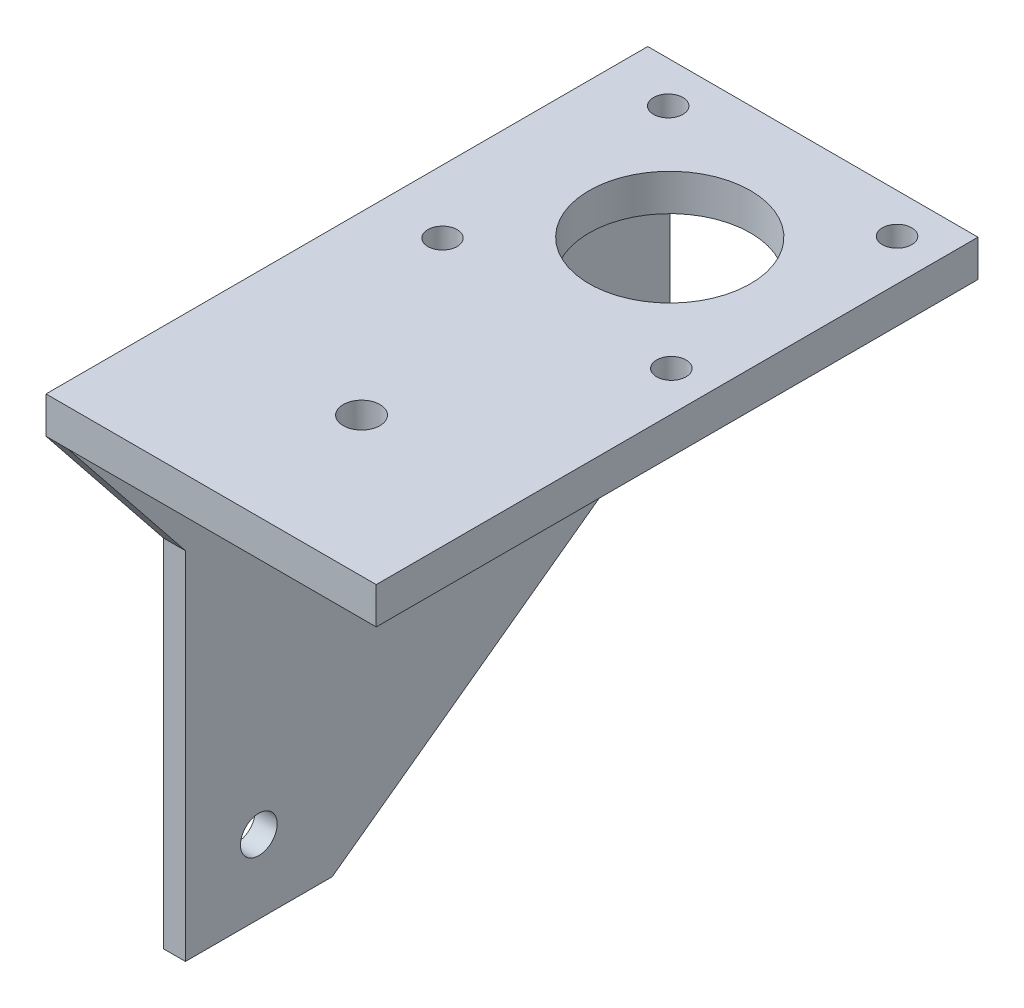
ISO-10303-21;
HEADER;
FILE_DESCRIPTION(('STEP AP214'),'2;1');
FILE_NAME('part.step','',(''),(''),'','','');
FILE_SCHEMA(('AUTOMOTIVE_DESIGN { 1 0 10303 214 1 1 1 1 }'));
ENDSEC;
DATA;
#1=APPLICATION_CONTEXT('core data for automotive mechanical design processes');
#2=APPLICATION_PROTOCOL_DEFINITION('international standard','automotive_design',2000,#1);
#3=PRODUCT_CONTEXT('',#1,'mechanical');
#4=PRODUCT('Part','Part','',(#3));
#5=PRODUCT_RELATED_PRODUCT_CATEGORY('part','',(#4));
#6=PRODUCT_DEFINITION_FORMATION('','',#4);
#7=PRODUCT_DEFINITION_CONTEXT('part definition',#1,'design');
#8=PRODUCT_DEFINITION('design','',#6,#7);
#9=PRODUCT_DEFINITION_SHAPE('','',#8);
#10=(LENGTH_UNIT() NAMED_UNIT(*) SI_UNIT(.MILLI.,.METRE.));
#11=(NAMED_UNIT(*) PLANE_ANGLE_UNIT() SI_UNIT($,.RADIAN.));
#12=(NAMED_UNIT(*) SI_UNIT($,.STERADIAN.) SOLID_ANGLE_UNIT());
#13=UNCERTAINTY_MEASURE_WITH_UNIT(LENGTH_MEASURE(1.E-05),#10,'distance_accuracy_value','');
#14=(GEOMETRIC_REPRESENTATION_CONTEXT(3) GLOBAL_UNCERTAINTY_ASSIGNED_CONTEXT((#13)) GLOBAL_UNIT_ASSIGNED_CONTEXT((#10,
#11,#12)) REPRESENTATION_CONTEXT('',''));
#15=CARTESIAN_POINT('',(0.,0.,0.));
#16=DIRECTION('',(0.,0.,1.));
#17=DIRECTION('',(1.,0.,0.));
#18=AXIS2_PLACEMENT_3D('',#15,#16,#17);
#19=CARTESIAN_POINT('',(0.,5.,-42.));
#20=DIRECTION('',(0.,-1.,0.));
#21=DIRECTION('',(0.,0.,1.));
#22=AXIS2_PLACEMENT_3D('',#19,#20,#21);
#23=PLANE('',#22);
#24=CARTESIAN_POINT('',(0.,5.,0.));
#25=DIRECTION('',(0.,1.,0.));
#26=DIRECTION('',(0.,0.,1.));
#27=AXIS2_PLACEMENT_3D('',#24,#25,#26);
#28=CIRCLE('',#27,2.5);
#29=CARTESIAN_POINT('',(0.,5.,2.5));
#30=VERTEX_POINT('',#29);
#31=EDGE_CURVE('E223',#30,#30,#28,.T.);
#32=ORIENTED_EDGE('',*,*,#31,.F.);
#33=EDGE_LOOP('',(#32));
#34=FACE_BOUND('',#33,.T.);
#35=DIRECTION('',(0.,0.,1.));
#36=VECTOR('',#35,1.);
#37=CARTESIAN_POINT('',(21.,5.,-63.));
#38=LINE('',#37,#36);
#39=CARTESIAN_POINT('',(21.,5.,-63.));
#40=VERTEX_POINT('',#39);
#41=CARTESIAN_POINT('',(21.,5.,19.));
#42=VERTEX_POINT('',#41);
#43=EDGE_CURVE('E67',#40,#42,#38,.T.);
#44=ORIENTED_EDGE('',*,*,#43,.F.);
#45=DIRECTION('',(1.,0.,0.));
#46=VECTOR('',#45,1.);
#47=CARTESIAN_POINT('',(-21.,5.,-63.));
#48=LINE('',#47,#46);
#49=CARTESIAN_POINT('',(-24.,5.,-63.));
#50=VERTEX_POINT('',#49);
#51=EDGE_CURVE('E45',#50,#40,#48,.T.);
#52=ORIENTED_EDGE('',*,*,#51,.F.);
#53=DIRECTION('',(0.,0.,-1.));
#54=VECTOR('',#53,1.);
#55=CARTESIAN_POINT('',(-24.,5.,19.));
#56=LINE('',#55,#54);
#57=CARTESIAN_POINT('',(-24.,5.,19.));
#58=VERTEX_POINT('',#57);
#59=EDGE_CURVE('E115',#58,#50,#56,.T.);
#60=ORIENTED_EDGE('',*,*,#59,.F.);
#61=DIRECTION('',(-1.,0.,0.));
#62=VECTOR('',#61,1.);
#63=CARTESIAN_POINT('',(-21.,5.,19.));
#64=LINE('',#63,#62);
#65=EDGE_CURVE('E173',#42,#58,#64,.T.);
#66=ORIENTED_EDGE('',*,*,#65,.F.);
#67=EDGE_LOOP('',(#44,#52,#60,#66));
#68=FACE_BOUND('',#67,.T.);
#69=CARTESIAN_POINT('',(0.,5.,-42.));
#70=DIRECTION('',(0.,-1.,0.));
#71=DIRECTION('',(0.,0.,-1.));
#72=AXIS2_PLACEMENT_3D('',#69,#70,#71);
#73=CIRCLE('',#72,11.);
#74=CARTESIAN_POINT('',(0.,5.,-53.));
#75=VERTEX_POINT('',#74);
#76=EDGE_CURVE('E200',#75,#75,#73,.T.);
#77=ORIENTED_EDGE('',*,*,#76,.T.);
#78=EDGE_LOOP('',(#77));
#79=FACE_BOUND('',#78,.T.);
#80=CARTESIAN_POINT('',(-15.592519129157,5.,-57.3780150606921));
#81=DIRECTION('',(0.,-1.,0.));
#82=DIRECTION('',(0.,0.,-1.));
#83=AXIS2_PLACEMENT_3D('',#80,#81,#82);
#84=CIRCLE('',#83,2.);
#85=CARTESIAN_POINT('',(-15.592519129157,5.,-59.3780150606921));
#86=VERTEX_POINT('',#85);
#87=EDGE_CURVE('E194',#86,#86,#84,.T.);
#88=ORIENTED_EDGE('',*,*,#87,.T.);
#89=EDGE_LOOP('',(#88));
#90=FACE_BOUND('',#89,.T.);
#91=CARTESIAN_POINT('',(-15.3780150606921,5.,-26.407480870843));
#92=DIRECTION('',(0.,-1.,0.));
#93=DIRECTION('',(0.,0.,-1.));
#94=AXIS2_PLACEMENT_3D('',#91,#92,#93);
#95=CIRCLE('',#94,2.);
#96=CARTESIAN_POINT('',(-15.3780150606921,5.,-28.407480870843));
#97=VERTEX_POINT('',#96);
#98=EDGE_CURVE('E188',#97,#97,#95,.T.);
#99=ORIENTED_EDGE('',*,*,#98,.T.);
#100=EDGE_LOOP('',(#99));
#101=FACE_BOUND('',#100,.T.);
#102=CARTESIAN_POINT('',(15.592519129157,5.,-26.6219849393079));
#103=DIRECTION('',(0.,-1.,0.));
#104=DIRECTION('',(0.,0.,-1.));
#105=AXIS2_PLACEMENT_3D('',#102,#103,#104);
#106=CIRCLE('',#105,2.);
#107=CARTESIAN_POINT('',(15.592519129157,5.,-28.6219849393079));
#108=VERTEX_POINT('',#107);
#109=EDGE_CURVE('E182',#108,#108,#106,.T.);
#110=ORIENTED_EDGE('',*,*,#109,.T.);
#111=EDGE_LOOP('',(#110));
#112=FACE_BOUND('',#111,.T.);
#113=CARTESIAN_POINT('',(15.3780150606921,5.,-57.592519129157));
#114=DIRECTION('',(0.,-1.,0.));
#115=DIRECTION('',(0.,0.,-1.));
#116=AXIS2_PLACEMENT_3D('',#113,#114,#115);
#117=CIRCLE('',#116,2.);
#118=CARTESIAN_POINT('',(15.3780150606921,5.,-59.592519129157));
#119=VERTEX_POINT('',#118);
#120=EDGE_CURVE('E176',#119,#119,#117,.T.);
#121=ORIENTED_EDGE('',*,*,#120,.T.);
#122=EDGE_LOOP('',(#121));
#123=FACE_BOUND('',#122,.T.);
#124=ADVANCED_FACE('F35',(#34,#68,#79,#90,#101,#112,#123),#23,.F.);
#125=CARTESIAN_POINT('',(0.,0.,-42.));
#126=DIRECTION('',(0.,-1.,0.));
#127=DIRECTION('',(0.,0.,1.));
#128=AXIS2_PLACEMENT_3D('',#125,#126,#127);
#129=PLANE('',#128);
#130=CARTESIAN_POINT('',(0.,0.,0.));
#131=DIRECTION('',(0.,-1.,0.));
#132=DIRECTION('',(0.,0.,-1.));
#133=AXIS2_PLACEMENT_3D('',#130,#131,#132);
#134=CIRCLE('',#133,2.5);
#135=CARTESIAN_POINT('',(0.,0.,-2.5));
#136=VERTEX_POINT('',#135);
#137=EDGE_CURVE('E39',#136,#136,#134,.T.);
#138=ORIENTED_EDGE('',*,*,#137,.F.);
#139=EDGE_LOOP('',(#138));
#140=FACE_BOUND('',#139,.T.);
#141=CARTESIAN_POINT('',(15.592519129157,0.,-26.6219849393079));
#142=DIRECTION('',(0.,-1.,0.));
#143=DIRECTION('',(0.,0.,-1.));
#144=AXIS2_PLACEMENT_3D('',#141,#142,#143);
#145=CIRCLE('',#144,2.);
#146=CARTESIAN_POINT('',(15.592519129157,0.,-28.6219849393079));
#147=VERTEX_POINT('',#146);
#148=EDGE_CURVE('E179',#147,#147,#145,.T.);
#149=ORIENTED_EDGE('',*,*,#148,.F.);
#150=EDGE_LOOP('',(#149));
#151=FACE_BOUND('',#150,.T.);
#152=CARTESIAN_POINT('',(-15.592519129157,0.,-57.3780150606921));
#153=DIRECTION('',(0.,-1.,0.));
#154=DIRECTION('',(0.,0.,-1.));
#155=AXIS2_PLACEMENT_3D('',#152,#153,#154);
#156=CIRCLE('',#155,2.);
#157=CARTESIAN_POINT('',(-15.592519129157,0.,-59.3780150606921));
#158=VERTEX_POINT('',#157);
#159=EDGE_CURVE('E191',#158,#158,#156,.T.);
#160=ORIENTED_EDGE('',*,*,#159,.F.);
#161=EDGE_LOOP('',(#160));
#162=FACE_BOUND('',#161,.T.);
#163=DIRECTION('',(0.,0.,1.));
#164=VECTOR('',#163,1.);
#165=CARTESIAN_POINT('',(21.,0.,-63.));
#166=LINE('',#165,#164);
#167=CARTESIAN_POINT('',(21.,0.,-63.));
#168=VERTEX_POINT('',#167);
#169=CARTESIAN_POINT('',(21.,0.,19.));
#170=VERTEX_POINT('',#169);
#171=EDGE_CURVE('E74',#168,#170,#166,.T.);
#172=ORIENTED_EDGE('',*,*,#171,.T.);
#173=DIRECTION('',(1.,0.,0.));
#174=VECTOR('',#173,1.);
#175=CARTESIAN_POINT('',(-21.,0.,19.));
#176=LINE('',#175,#174);
#177=CARTESIAN_POINT('',(-21.,0.,19.));
#178=VERTEX_POINT('',#177);
#179=EDGE_CURVE('E169',#178,#170,#176,.T.);
#180=ORIENTED_EDGE('',*,*,#179,.F.);
#181=DIRECTION('',(0.,0.,-1.));
#182=VECTOR('',#181,1.);
#183=CARTESIAN_POINT('',(-21.,0.,-63.));
#184=LINE('',#183,#182);
#185=CARTESIAN_POINT('',(-21.,0.,-63.));
#186=VERTEX_POINT('',#185);
#187=EDGE_CURVE('E208',#178,#186,#184,.T.);
#188=ORIENTED_EDGE('',*,*,#187,.T.);
#189=DIRECTION('',(1.,0.,0.));
#190=VECTOR('',#189,1.);
#191=CARTESIAN_POINT('',(-21.,0.,-63.));
#192=LINE('',#191,#190);
#193=EDGE_CURVE('E205',#186,#168,#192,.T.);
#194=ORIENTED_EDGE('',*,*,#193,.T.);
#195=EDGE_LOOP('',(#172,#180,#188,#194));
#196=FACE_BOUND('',#195,.T.);
#197=CARTESIAN_POINT('',(0.,0.,-42.));
#198=DIRECTION('',(0.,-1.,0.));
#199=DIRECTION('',(0.,0.,-1.));
#200=AXIS2_PLACEMENT_3D('',#197,#198,#199);
#201=CIRCLE('',#200,11.);
#202=CARTESIAN_POINT('',(0.,0.,-53.));
#203=VERTEX_POINT('',#202);
#204=EDGE_CURVE('E197',#203,#203,#201,.T.);
#205=ORIENTED_EDGE('',*,*,#204,.F.);
#206=EDGE_LOOP('',(#205));
#207=FACE_BOUND('',#206,.T.);
#208=CARTESIAN_POINT('',(-15.3780150606921,0.,-26.407480870843));
#209=DIRECTION('',(0.,-1.,0.));
#210=DIRECTION('',(0.,0.,-1.));
#211=AXIS2_PLACEMENT_3D('',#208,#209,#210);
#212=CIRCLE('',#211,2.);
#213=CARTESIAN_POINT('',(-15.3780150606921,0.,-28.407480870843));
#214=VERTEX_POINT('',#213);
#215=EDGE_CURVE('E185',#214,#214,#212,.T.);
#216=ORIENTED_EDGE('',*,*,#215,.F.);
#217=EDGE_LOOP('',(#216));
#218=FACE_BOUND('',#217,.T.);
#219=CARTESIAN_POINT('',(15.3780150606921,0.,-57.592519129157));
#220=DIRECTION('',(0.,-1.,0.));
#221=DIRECTION('',(0.,0.,-1.));
#222=AXIS2_PLACEMENT_3D('',#219,#220,#221);
#223=CIRCLE('',#222,2.);
#224=CARTESIAN_POINT('',(15.3780150606921,0.,-59.592519129157));
#225=VERTEX_POINT('',#224);
#226=EDGE_CURVE('E175',#225,#225,#223,.T.);
#227=ORIENTED_EDGE('',*,*,#226,.F.);
#228=EDGE_LOOP('',(#227));
#229=FACE_BOUND('',#228,.T.);
#230=ADVANCED_FACE('F231',(#140,#151,#162,#196,#207,#218,#229),#129,.T.);
#231=CARTESIAN_POINT('',(21.,5.,-63.));
#232=DIRECTION('',(-1.,0.,0.));
#233=DIRECTION('',(0.,0.,-1.));
#234=AXIS2_PLACEMENT_3D('',#231,#232,#233);
#235=PLANE('',#234);
#236=ORIENTED_EDGE('',*,*,#171,.F.);
#237=DIRECTION('',(0.,-1.,0.));
#238=VECTOR('',#237,1.);
#239=CARTESIAN_POINT('',(21.,5.,-63.));
#240=LINE('',#239,#238);
#241=EDGE_CURVE('E11',#40,#168,#240,.T.);
#242=ORIENTED_EDGE('',*,*,#241,.F.);
#243=ORIENTED_EDGE('',*,*,#43,.T.);
#244=DIRECTION('',(0.,1.,0.));
#245=VECTOR('',#244,1.);
#246=CARTESIAN_POINT('',(21.,5.,19.));
#247=LINE('',#246,#245);
#248=EDGE_CURVE('E171',#170,#42,#247,.T.);
#249=ORIENTED_EDGE('',*,*,#248,.F.);
#250=EDGE_LOOP('',(#236,#242,#243,#249));
#251=FACE_BOUND('',#250,.T.);
#252=ADVANCED_FACE('F37',(#251),#235,.F.);
#253=CARTESIAN_POINT('',(-21.,5.,-63.));
#254=DIRECTION('',(0.,0.,1.));
#255=DIRECTION('',(-1.,0.,0.));
#256=AXIS2_PLACEMENT_3D('',#253,#254,#255);
#257=PLANE('',#256);
#258=ORIENTED_EDGE('',*,*,#193,.F.);
#259=DIRECTION('',(0.,-1.,0.));
#260=VECTOR('',#259,1.);
#261=CARTESIAN_POINT('',(-21.,5.,-63.));
#262=LINE('',#261,#260);
#263=CARTESIAN_POINT('',(-21.,-35.,-63.));
#264=VERTEX_POINT('',#263);
#265=EDGE_CURVE('E62',#186,#264,#262,.T.);
#266=ORIENTED_EDGE('',*,*,#265,.T.);
#267=DIRECTION('',(1.,0.,0.));
#268=VECTOR('',#267,1.);
#269=CARTESIAN_POINT('',(-24.,-35.,-63.));
#270=LINE('',#269,#268);
#271=CARTESIAN_POINT('',(-24.,-35.,-63.));
#272=VERTEX_POINT('',#271);
#273=EDGE_CURVE('E122',#272,#264,#270,.T.);
#274=ORIENTED_EDGE('',*,*,#273,.F.);
#275=DIRECTION('',(0.,-1.,0.));
#276=VECTOR('',#275,1.);
#277=CARTESIAN_POINT('',(-24.,5.,-63.));
#278=LINE('',#277,#276);
#279=EDGE_CURVE('E119',#50,#272,#278,.T.);
#280=ORIENTED_EDGE('',*,*,#279,.F.);
#281=ORIENTED_EDGE('',*,*,#51,.T.);
#282=ORIENTED_EDGE('',*,*,#241,.T.);
#283=EDGE_LOOP('',(#258,#266,#274,#280,#281,#282));
#284=FACE_BOUND('',#283,.T.);
#285=ADVANCED_FACE('F120',(#284),#257,.F.);
#286=CARTESIAN_POINT('',(0.,5.,-42.));
#287=DIRECTION('',(0.,-1.,0.));
#288=DIRECTION('',(0.,0.,1.));
#289=AXIS2_PLACEMENT_3D('',#286,#287,#288);
#290=CYLINDRICAL_SURFACE('',#289,11.);
#291=ORIENTED_EDGE('',*,*,#76,.F.);
#292=EDGE_LOOP('',(#291));
#293=FACE_BOUND('',#292,.T.);
#294=ORIENTED_EDGE('',*,*,#204,.T.);
#295=EDGE_LOOP('',(#294));
#296=FACE_BOUND('',#295,.T.);
#297=ADVANCED_FACE('F240',(#293,#296),#290,.F.);
#298=CARTESIAN_POINT('',(-15.592519129157,5.,-57.3780150606921));
#299=DIRECTION('',(0.,-1.,0.));
#300=DIRECTION('',(0.,0.,1.));
#301=AXIS2_PLACEMENT_3D('',#298,#299,#300);
#302=CYLINDRICAL_SURFACE('',#301,2.);
#303=ORIENTED_EDGE('',*,*,#87,.F.);
#304=EDGE_LOOP('',(#303));
#305=FACE_BOUND('',#304,.T.);
#306=ORIENTED_EDGE('',*,*,#159,.T.);
#307=EDGE_LOOP('',(#306));
#308=FACE_BOUND('',#307,.T.);
#309=ADVANCED_FACE('F247',(#305,#308),#302,.F.);
#310=CARTESIAN_POINT('',(-15.3780150606921,5.,-26.407480870843));
#311=DIRECTION('',(0.,-1.,0.));
#312=DIRECTION('',(0.,0.,1.));
#313=AXIS2_PLACEMENT_3D('',#310,#311,#312);
#314=CYLINDRICAL_SURFACE('',#313,2.);
#315=ORIENTED_EDGE('',*,*,#98,.F.);
#316=EDGE_LOOP('',(#315));
#317=FACE_BOUND('',#316,.T.);
#318=ORIENTED_EDGE('',*,*,#215,.T.);
#319=EDGE_LOOP('',(#318));
#320=FACE_BOUND('',#319,.T.);
#321=ADVANCED_FACE('F290',(#317,#320),#314,.F.);
#322=CARTESIAN_POINT('',(15.592519129157,5.,-26.6219849393079));
#323=DIRECTION('',(0.,-1.,0.));
#324=DIRECTION('',(0.,0.,1.));
#325=AXIS2_PLACEMENT_3D('',#322,#323,#324);
#326=CYLINDRICAL_SURFACE('',#325,2.);
#327=ORIENTED_EDGE('',*,*,#109,.F.);
#328=EDGE_LOOP('',(#327));
#329=FACE_BOUND('',#328,.T.);
#330=ORIENTED_EDGE('',*,*,#148,.T.);
#331=EDGE_LOOP('',(#330));
#332=FACE_BOUND('',#331,.T.);
#333=ADVANCED_FACE('F286',(#329,#332),#326,.F.);
#334=CARTESIAN_POINT('',(15.3780150606921,5.,-57.592519129157));
#335=DIRECTION('',(0.,-1.,0.));
#336=DIRECTION('',(0.,0.,1.));
#337=AXIS2_PLACEMENT_3D('',#334,#335,#336);
#338=CYLINDRICAL_SURFACE('',#337,2.);
#339=ORIENTED_EDGE('',*,*,#120,.F.);
#340=EDGE_LOOP('',(#339));
#341=FACE_BOUND('',#340,.T.);
#342=ORIENTED_EDGE('',*,*,#226,.T.);
#343=EDGE_LOOP('',(#342));
#344=FACE_BOUND('',#343,.T.);
#345=ADVANCED_FACE('F280',(#341,#344),#338,.F.);
#346=CARTESIAN_POINT('',(0.,0.,19.));
#347=DIRECTION('',(0.,0.,1.));
#348=DIRECTION('',(1.,0.,0.));
#349=AXIS2_PLACEMENT_3D('',#346,#347,#348);
#350=PLANE('',#349);
#351=ORIENTED_EDGE('',*,*,#65,.T.);
#352=DIRECTION('',(0.,1.,0.));
#353=VECTOR('',#352,1.);
#354=CARTESIAN_POINT('',(-24.,0.,19.));
#355=LINE('',#354,#353);
#356=CARTESIAN_POINT('',(-24.,0.,19.));
#357=VERTEX_POINT('',#356);
#358=EDGE_CURVE('E130',#357,#58,#355,.T.);
#359=ORIENTED_EDGE('',*,*,#358,.F.);
#360=DIRECTION('',(1.,0.,0.));
#361=VECTOR('',#360,1.);
#362=CARTESIAN_POINT('',(-24.,0.,19.));
#363=LINE('',#362,#361);
#364=EDGE_CURVE('E148',#357,#178,#363,.T.);
#365=ORIENTED_EDGE('',*,*,#364,.T.);
#366=ORIENTED_EDGE('',*,*,#179,.T.);
#367=ORIENTED_EDGE('',*,*,#248,.T.);
#368=EDGE_LOOP('',(#351,#359,#365,#366,#367));
#369=FACE_BOUND('',#368,.T.);
#370=ADVANCED_FACE('F254',(#369),#350,.T.);
#371=CARTESIAN_POINT('',(-24.,-35.,-63.));
#372=DIRECTION('',(0.,0.808520963920778,0.588467374542222));
#373=DIRECTION('',(0.,-0.588467374542222,0.808520963920778));
#374=AXIS2_PLACEMENT_3D('',#371,#372,#373);
#375=PLANE('',#374);
#376=DIRECTION('',(0.,-0.588467374542222,0.808520963920778));
#377=VECTOR('',#376,1.);
#378=CARTESIAN_POINT('',(-21.,-35.,-63.));
#379=LINE('',#378,#377);
#380=CARTESIAN_POINT('',(-21.,-68.4802688327011,-16.9999999999999));
#381=VERTEX_POINT('',#380);
#382=EDGE_CURVE('E150',#264,#381,#379,.T.);
#383=ORIENTED_EDGE('',*,*,#382,.T.);
#384=DIRECTION('',(1.,0.,0.));
#385=VECTOR('',#384,1.);
#386=CARTESIAN_POINT('',(-24.,-68.4802688327011,-16.9999999999999));
#387=LINE('',#386,#385);
#388=CARTESIAN_POINT('',(-24.,-68.4802688327011,-16.9999999999999));
#389=VERTEX_POINT('',#388);
#390=EDGE_CURVE('E165',#389,#381,#387,.T.);
#391=ORIENTED_EDGE('',*,*,#390,.F.);
#392=DIRECTION('',(0.,-0.588467374542222,0.808520963920778));
#393=VECTOR('',#392,1.);
#394=CARTESIAN_POINT('',(-24.,-35.,-63.));
#395=LINE('',#394,#393);
#396=EDGE_CURVE('E125',#272,#389,#395,.T.);
#397=ORIENTED_EDGE('',*,*,#396,.F.);
#398=ORIENTED_EDGE('',*,*,#273,.T.);
#399=EDGE_LOOP('',(#383,#391,#397,#398));
#400=FACE_BOUND('',#399,.T.);
#401=ADVANCED_FACE('F273',(#400),#375,.F.);
#402=CARTESIAN_POINT('',(-24.,-68.4802688327011,-16.9999999999999));
#403=DIRECTION('',(0.,1.,0.));
#404=DIRECTION('',(0.,0.,1.));
#405=AXIS2_PLACEMENT_3D('',#402,#403,#404);
#406=PLANE('',#405);
#407=DIRECTION('',(0.,0.,1.));
#408=VECTOR('',#407,1.);
#409=CARTESIAN_POINT('',(-21.,-68.4802688327011,-16.9999999999999));
#410=LINE('',#409,#408);
#411=CARTESIAN_POINT('',(-21.,-68.4802688327011,3.00000000000007));
#412=VERTEX_POINT('',#411);
#413=EDGE_CURVE('E153',#381,#412,#410,.T.);
#414=ORIENTED_EDGE('',*,*,#413,.T.);
#415=DIRECTION('',(1.,0.,0.));
#416=VECTOR('',#415,1.);
#417=CARTESIAN_POINT('',(-24.,-68.4802688327011,3.00000000000007));
#418=LINE('',#417,#416);
#419=CARTESIAN_POINT('',(-24.,-68.4802688327011,3.00000000000007));
#420=VERTEX_POINT('',#419);
#421=EDGE_CURVE('E162',#420,#412,#418,.T.);
#422=ORIENTED_EDGE('',*,*,#421,.F.);
#423=DIRECTION('',(0.,0.,1.));
#424=VECTOR('',#423,1.);
#425=CARTESIAN_POINT('',(-24.,-68.4802688327011,-16.9999999999999));
#426=LINE('',#425,#424);
#427=EDGE_CURVE('E141',#389,#420,#426,.T.);
#428=ORIENTED_EDGE('',*,*,#427,.F.);
#429=ORIENTED_EDGE('',*,*,#390,.T.);
#430=EDGE_LOOP('',(#414,#422,#428,#429));
#431=FACE_BOUND('',#430,.T.);
#432=ADVANCED_FACE('F269',(#431),#406,.F.);
#433=CARTESIAN_POINT('',(-24.,-42.1563099903324,3.00000000000007));
#434=DIRECTION('',(0.,0.,-1.));
#435=DIRECTION('',(-1.,0.,0.));
#436=AXIS2_PLACEMENT_3D('',#433,#434,#435);
#437=PLANE('',#436);
#438=DIRECTION('',(0.,1.,0.));
#439=VECTOR('',#438,1.);
#440=CARTESIAN_POINT('',(-21.,-42.1563099903324,3.00000000000007));
#441=LINE('',#440,#439);
#442=CARTESIAN_POINT('',(-21.,-20.,3.00000000000007));
#443=VERTEX_POINT('',#442);
#444=EDGE_CURVE('E134',#412,#443,#441,.T.);
#445=ORIENTED_EDGE('',*,*,#444,.T.);
#446=DIRECTION('',(1.,0.,0.));
#447=VECTOR('',#446,1.);
#448=CARTESIAN_POINT('',(-24.,-20.,3.00000000000007));
#449=LINE('',#448,#447);
#450=CARTESIAN_POINT('',(-24.,-20.,3.00000000000007));
#451=VERTEX_POINT('',#450);
#452=EDGE_CURVE('E159',#451,#443,#449,.T.);
#453=ORIENTED_EDGE('',*,*,#452,.F.);
#454=DIRECTION('',(0.,1.,0.));
#455=VECTOR('',#454,1.);
#456=CARTESIAN_POINT('',(-24.,-68.4802688327011,3.00000000000007));
#457=LINE('',#456,#455);
#458=EDGE_CURVE('E143',#420,#451,#457,.T.);
#459=ORIENTED_EDGE('',*,*,#458,.F.);
#460=ORIENTED_EDGE('',*,*,#421,.T.);
#461=EDGE_LOOP('',(#445,#453,#459,#460));
#462=FACE_BOUND('',#461,.T.);
#463=ADVANCED_FACE('F265',(#462),#437,.F.);
#464=CARTESIAN_POINT('',(-24.,-20.,3.00000000000007));
#465=DIRECTION('',(0.,0.624695047554422,-0.780868809443032));
#466=DIRECTION('',(0.,0.780868809443032,0.624695047554422));
#467=AXIS2_PLACEMENT_3D('',#464,#465,#466);
#468=PLANE('',#467);
#469=DIRECTION('',(0.,0.780868809443032,0.624695047554422));
#470=VECTOR('',#469,1.);
#471=CARTESIAN_POINT('',(-21.,-20.,3.00000000000007));
#472=LINE('',#471,#470);
#473=EDGE_CURVE('E131',#443,#178,#472,.T.);
#474=ORIENTED_EDGE('',*,*,#473,.T.);
#475=ORIENTED_EDGE('',*,*,#364,.F.);
#476=DIRECTION('',(0.,0.780868809443032,0.624695047554422));
#477=VECTOR('',#476,1.);
#478=CARTESIAN_POINT('',(-24.,-20.,3.00000000000007));
#479=LINE('',#478,#477);
#480=EDGE_CURVE('E145',#451,#357,#479,.T.);
#481=ORIENTED_EDGE('',*,*,#480,.F.);
#482=ORIENTED_EDGE('',*,*,#452,.T.);
#483=EDGE_LOOP('',(#474,#475,#481,#482));
#484=FACE_BOUND('',#483,.T.);
#485=ADVANCED_FACE('F260',(#484),#468,.F.);
#486=CARTESIAN_POINT('',(-24.,0.,0.));
#487=DIRECTION('',(-1.,0.,0.));
#488=DIRECTION('',(0.,0.,1.));
#489=AXIS2_PLACEMENT_3D('',#486,#487,#488);
#490=PLANE('',#489);
#491=CARTESIAN_POINT('',(-24.,-58.4802688327011,-6.99999999999993));
#492=DIRECTION('',(-1.,0.,0.));
#493=DIRECTION('',(0.,0.,1.));
#494=AXIS2_PLACEMENT_3D('',#491,#492,#493);
#495=CIRCLE('',#494,2.5);
#496=CARTESIAN_POINT('',(-24.,-58.4802688327011,-4.49999999999993));
#497=VERTEX_POINT('',#496);
#498=EDGE_CURVE('E215',#497,#497,#495,.T.);
#499=ORIENTED_EDGE('',*,*,#498,.F.);
#500=EDGE_LOOP('',(#499));
#501=FACE_BOUND('',#500,.T.);
#502=CARTESIAN_POINT('',(-24.,-8.,-6.99999999999993));
#503=DIRECTION('',(-1.,0.,0.));
#504=DIRECTION('',(0.,0.,1.));
#505=AXIS2_PLACEMENT_3D('',#502,#503,#504);
#506=CIRCLE('',#505,2.5);
#507=CARTESIAN_POINT('',(-24.,-8.,-4.49999999999993));
#508=VERTEX_POINT('',#507);
#509=EDGE_CURVE('E137',#508,#508,#506,.T.);
#510=ORIENTED_EDGE('',*,*,#509,.F.);
#511=EDGE_LOOP('',(#510));
#512=FACE_BOUND('',#511,.T.);
#513=ORIENTED_EDGE('',*,*,#59,.T.);
#514=ORIENTED_EDGE('',*,*,#279,.T.);
#515=ORIENTED_EDGE('',*,*,#396,.T.);
#516=ORIENTED_EDGE('',*,*,#427,.T.);
#517=ORIENTED_EDGE('',*,*,#458,.T.);
#518=ORIENTED_EDGE('',*,*,#480,.T.);
#519=ORIENTED_EDGE('',*,*,#358,.T.);
#520=EDGE_LOOP('',(#513,#514,#515,#516,#517,#518,#519));
#521=FACE_BOUND('',#520,.T.);
#522=ADVANCED_FACE('F128',(#501,#512,#521),#490,.T.);
#523=CARTESIAN_POINT('',(-21.,0.,0.));
#524=DIRECTION('',(-1.,0.,0.));
#525=DIRECTION('',(0.,0.,1.));
#526=AXIS2_PLACEMENT_3D('',#523,#524,#525);
#527=PLANE('',#526);
#528=CARTESIAN_POINT('',(-21.,-58.4802688327011,-6.99999999999993));
#529=DIRECTION('',(-1.,0.,0.));
#530=DIRECTION('',(0.,0.,1.));
#531=AXIS2_PLACEMENT_3D('',#528,#529,#530);
#532=CIRCLE('',#531,2.5);
#533=CARTESIAN_POINT('',(-21.,-58.4802688327011,-4.49999999999993));
#534=VERTEX_POINT('',#533);
#535=EDGE_CURVE('E213',#534,#534,#532,.T.);
#536=ORIENTED_EDGE('',*,*,#535,.T.);
#537=EDGE_LOOP('',(#536));
#538=FACE_BOUND('',#537,.T.);
#539=CARTESIAN_POINT('',(-21.,-8.,-6.99999999999993));
#540=DIRECTION('',(-1.,0.,0.));
#541=DIRECTION('',(0.,0.,1.));
#542=AXIS2_PLACEMENT_3D('',#539,#540,#541);
#543=CIRCLE('',#542,2.5);
#544=CARTESIAN_POINT('',(-21.,-8.,-4.49999999999993));
#545=VERTEX_POINT('',#544);
#546=EDGE_CURVE('E151',#545,#545,#543,.T.);
#547=ORIENTED_EDGE('',*,*,#546,.T.);
#548=EDGE_LOOP('',(#547));
#549=FACE_BOUND('',#548,.T.);
#550=ORIENTED_EDGE('',*,*,#187,.F.);
#551=ORIENTED_EDGE('',*,*,#473,.F.);
#552=ORIENTED_EDGE('',*,*,#444,.F.);
#553=ORIENTED_EDGE('',*,*,#413,.F.);
#554=ORIENTED_EDGE('',*,*,#382,.F.);
#555=ORIENTED_EDGE('',*,*,#265,.F.);
#556=EDGE_LOOP('',(#550,#551,#552,#553,#554,#555));
#557=FACE_BOUND('',#556,.T.);
#558=ADVANCED_FACE('F258',(#538,#549,#557),#527,.F.);
#559=CARTESIAN_POINT('',(-14.,-8.,-6.99999999999993));
#560=DIRECTION('',(-1.,0.,0.));
#561=DIRECTION('',(0.,0.,1.));
#562=AXIS2_PLACEMENT_3D('',#559,#560,#561);
#563=CYLINDRICAL_SURFACE('',#562,2.5);
#564=ORIENTED_EDGE('',*,*,#509,.T.);
#565=EDGE_LOOP('',(#564));
#566=FACE_BOUND('',#565,.T.);
#567=ORIENTED_EDGE('',*,*,#546,.F.);
#568=EDGE_LOOP('',(#567));
#569=FACE_BOUND('',#568,.T.);
#570=ADVANCED_FACE('F356',(#566,#569),#563,.F.);
#571=CARTESIAN_POINT('',(-14.,-58.4802688327011,-6.99999999999993));
#572=DIRECTION('',(-1.,0.,0.));
#573=DIRECTION('',(0.,0.,1.));
#574=AXIS2_PLACEMENT_3D('',#571,#572,#573);
#575=CYLINDRICAL_SURFACE('',#574,2.5);
#576=ORIENTED_EDGE('',*,*,#498,.T.);
#577=EDGE_LOOP('',(#576));
#578=FACE_BOUND('',#577,.T.);
#579=ORIENTED_EDGE('',*,*,#535,.F.);
#580=EDGE_LOOP('',(#579));
#581=FACE_BOUND('',#580,.T.);
#582=ADVANCED_FACE('F346',(#578,#581),#575,.F.);
#583=CARTESIAN_POINT('',(0.,-5.,0.));
#584=DIRECTION('',(0.,1.,0.));
#585=DIRECTION('',(0.,0.,1.));
#586=AXIS2_PLACEMENT_3D('',#583,#584,#585);
#587=CYLINDRICAL_SURFACE('',#586,2.5);
#588=ORIENTED_EDGE('',*,*,#137,.T.);
#589=EDGE_LOOP('',(#588));
#590=FACE_BOUND('',#589,.T.);
#591=ORIENTED_EDGE('',*,*,#31,.T.);
#592=EDGE_LOOP('',(#591));
#593=FACE_BOUND('',#592,.T.);
#594=ADVANCED_FACE('F228',(#590,#593),#587,.F.);
#595=CLOSED_SHELL('',(#124,#230,#252,#285,#297,#309,#321,#333,#345,#370,#401,#432,#463,#485,
#522,#558,#570,#582,#594));
#596=MANIFOLD_SOLID_BREP('B2',#595);
#597=ADVANCED_BREP_SHAPE_REPRESENTATION('',(#18,#596),#14);
#598=SHAPE_DEFINITION_REPRESENTATION(#9,#597);
ENDSEC;
END-ISO-10303-21;
